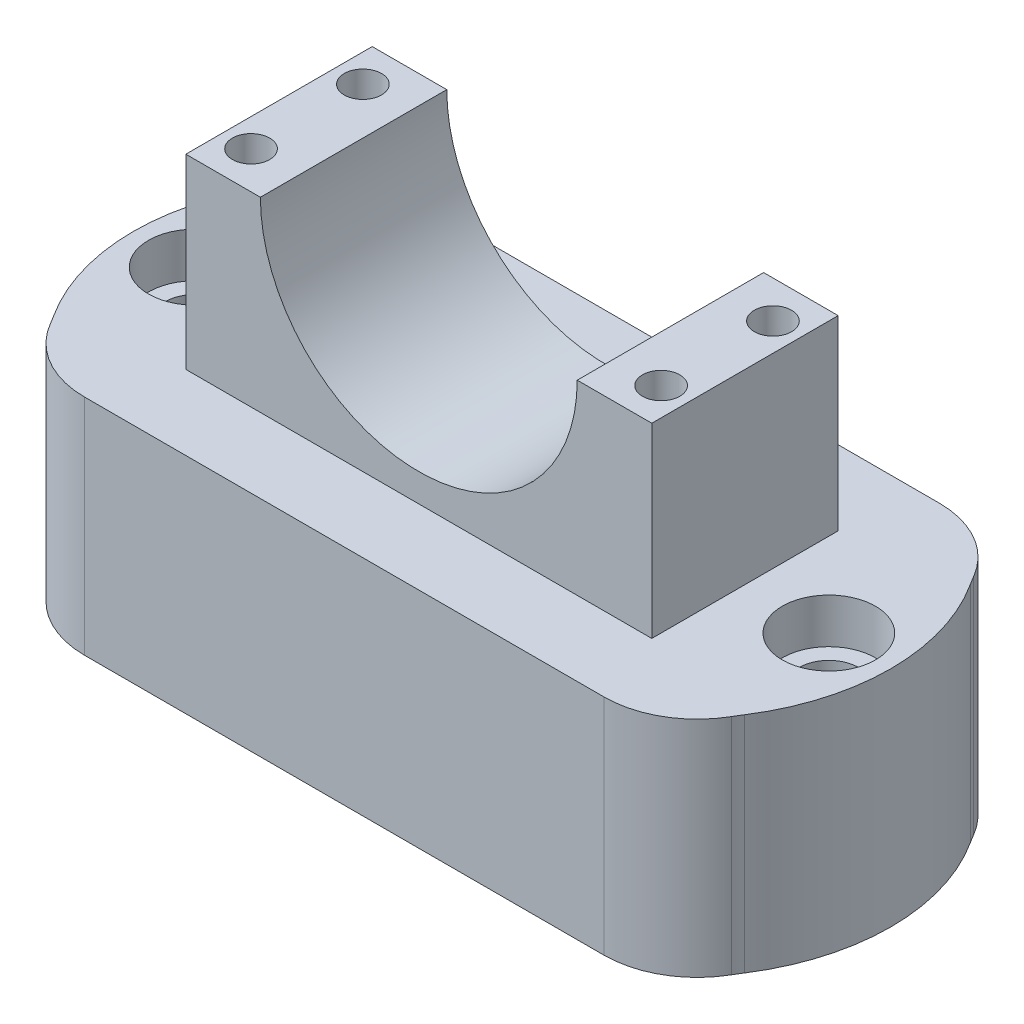
ISO-10303-21;
HEADER;
FILE_DESCRIPTION(('STEP AP214'),'2;1');
FILE_NAME('part.step','',(''),(''),'','','');
FILE_SCHEMA(('AUTOMOTIVE_DESIGN { 1 0 10303 214 1 1 1 1 }'));
ENDSEC;
DATA;
#1=APPLICATION_CONTEXT('core data for automotive mechanical design processes');
#2=APPLICATION_PROTOCOL_DEFINITION('international standard','automotive_design',2000,#1);
#3=PRODUCT_CONTEXT('',#1,'mechanical');
#4=PRODUCT('Part','Part','',(#3));
#5=PRODUCT_RELATED_PRODUCT_CATEGORY('part','',(#4));
#6=PRODUCT_DEFINITION_FORMATION('','',#4);
#7=PRODUCT_DEFINITION_CONTEXT('part definition',#1,'design');
#8=PRODUCT_DEFINITION('design','',#6,#7);
#9=PRODUCT_DEFINITION_SHAPE('','',#8);
#10=(LENGTH_UNIT() NAMED_UNIT(*) SI_UNIT(.MILLI.,.METRE.));
#11=(NAMED_UNIT(*) PLANE_ANGLE_UNIT() SI_UNIT($,.RADIAN.));
#12=(NAMED_UNIT(*) SI_UNIT($,.STERADIAN.) SOLID_ANGLE_UNIT());
#13=UNCERTAINTY_MEASURE_WITH_UNIT(LENGTH_MEASURE(1.E-05),#10,'distance_accuracy_value','');
#14=(GEOMETRIC_REPRESENTATION_CONTEXT(3) GLOBAL_UNCERTAINTY_ASSIGNED_CONTEXT((#13)) GLOBAL_UNIT_ASSIGNED_CONTEXT((#10,
#11,#12)) REPRESENTATION_CONTEXT('',''));
#15=CARTESIAN_POINT('',(0.,0.,0.));
#16=DIRECTION('',(0.,0.,1.));
#17=DIRECTION('',(1.,0.,0.));
#18=AXIS2_PLACEMENT_3D('',#15,#16,#17);
#19=CARTESIAN_POINT('',(43.9369456174816,-4.,-11.4773091677307));
#20=DIRECTION('',(0.,1.,0.));
#21=DIRECTION('',(0.,0.,1.));
#22=AXIS2_PLACEMENT_3D('',#19,#20,#21);
#23=CYLINDRICAL_SURFACE('',#22,10.);
#24=CARTESIAN_POINT('',(43.9369456174816,0.,-11.4773091677307));
#25=DIRECTION('',(0.,1.,0.));
#26=DIRECTION('',(0.,0.,1.));
#27=AXIS2_PLACEMENT_3D('',#24,#25,#26);
#28=CIRCLE('',#27,10.);
#29=CARTESIAN_POINT('',(35.267975472055,0.,-6.49243638924357));
#30=VERTEX_POINT('',#29);
#31=CARTESIAN_POINT('',(35.5353796736744,0.,-6.05387025023017));
#32=VERTEX_POINT('',#31);
#33=EDGE_CURVE('E317',#30,#32,#28,.T.);
#34=ORIENTED_EDGE('',*,*,#33,.F.);
#35=DIRECTION('',(0.,1.,0.));
#36=VECTOR('',#35,1.);
#37=CARTESIAN_POINT('',(35.267975472055,-4.,-6.49243638924357));
#38=LINE('',#37,#36);
#39=CARTESIAN_POINT('',(35.267975472055,12.,-6.49243638924357));
#40=VERTEX_POINT('',#39);
#41=EDGE_CURVE('E179',#30,#40,#38,.T.);
#42=ORIENTED_EDGE('',*,*,#41,.T.);
#43=CARTESIAN_POINT('',(43.9369456174816,12.,-11.4773091677307));
#44=DIRECTION('',(0.,1.,0.));
#45=DIRECTION('',(0.,0.,1.));
#46=AXIS2_PLACEMENT_3D('',#43,#44,#45);
#47=CIRCLE('',#46,10.);
#48=CARTESIAN_POINT('',(35.5353796736744,12.,-6.05387025023017));
#49=VERTEX_POINT('',#48);
#50=EDGE_CURVE('E174',#40,#49,#47,.T.);
#51=ORIENTED_EDGE('',*,*,#50,.T.);
#52=DIRECTION('',(0.,1.,0.));
#53=VECTOR('',#52,1.);
#54=CARTESIAN_POINT('',(35.5353796736744,-4.,-6.05387025023017));
#55=LINE('',#54,#53);
#56=EDGE_CURVE('E177',#32,#49,#55,.T.);
#57=ORIENTED_EDGE('',*,*,#56,.F.);
#58=EDGE_LOOP('',(#34,#42,#51,#57));
#59=FACE_BOUND('',#58,.T.);
#60=ADVANCED_FACE('F34',(#59),#23,.F.);
#61=CARTESIAN_POINT('',(-9.93694561748162,-4.,11.4773091677307));
#62=DIRECTION('',(0.,1.,0.));
#63=DIRECTION('',(0.,0.,1.));
#64=AXIS2_PLACEMENT_3D('',#61,#62,#63);
#65=CYLINDRICAL_SURFACE('',#64,9.99999999999999);
#66=CARTESIAN_POINT('',(-9.93694561748162,0.,11.4773091677307));
#67=DIRECTION('',(0.,1.,0.));
#68=DIRECTION('',(0.,0.,1.));
#69=AXIS2_PLACEMENT_3D('',#66,#67,#68);
#70=CIRCLE('',#69,9.99999999999999);
#71=CARTESIAN_POINT('',(-1.26797547205501,0.,6.49243638924358));
#72=VERTEX_POINT('',#71);
#73=CARTESIAN_POINT('',(-1.53537967367445,0.,6.05387025023018));
#74=VERTEX_POINT('',#73);
#75=EDGE_CURVE('E326',#72,#74,#70,.T.);
#76=ORIENTED_EDGE('',*,*,#75,.F.);
#77=DIRECTION('',(0.,1.,0.));
#78=VECTOR('',#77,1.);
#79=CARTESIAN_POINT('',(-1.26797547205501,-4.,6.49243638924358));
#80=LINE('',#79,#78);
#81=CARTESIAN_POINT('',(-1.26797547205501,12.,6.49243638924358));
#82=VERTEX_POINT('',#81);
#83=EDGE_CURVE('E350',#72,#82,#80,.T.);
#84=ORIENTED_EDGE('',*,*,#83,.T.);
#85=CARTESIAN_POINT('',(-9.93694561748162,12.,11.4773091677307));
#86=DIRECTION('',(0.,1.,0.));
#87=DIRECTION('',(0.,0.,1.));
#88=AXIS2_PLACEMENT_3D('',#85,#86,#87);
#89=CIRCLE('',#88,9.99999999999999);
#90=CARTESIAN_POINT('',(-1.53537967367445,12.,6.05387025023018));
#91=VERTEX_POINT('',#90);
#92=EDGE_CURVE('E215',#82,#91,#89,.T.);
#93=ORIENTED_EDGE('',*,*,#92,.T.);
#94=DIRECTION('',(0.,1.,0.));
#95=VECTOR('',#94,1.);
#96=CARTESIAN_POINT('',(-1.53537967367445,-4.,6.05387025023018));
#97=LINE('',#96,#95);
#98=EDGE_CURVE('E206',#74,#91,#97,.T.);
#99=ORIENTED_EDGE('',*,*,#98,.F.);
#100=EDGE_LOOP('',(#76,#84,#93,#99));
#101=FACE_BOUND('',#100,.T.);
#102=ADVANCED_FACE('F369',(#101),#65,.F.);
#103=CARTESIAN_POINT('',(0.,12.,0.));
#104=DIRECTION('',(0.,1.,0.));
#105=DIRECTION('',(0.,0.,1.));
#106=AXIS2_PLACEMENT_3D('',#103,#104,#105);
#107=PLANE('',#106);
#108=ORIENTED_EDGE('',*,*,#92,.F.);
#109=CARTESIAN_POINT('',(3.0665096006583,12.,4.00000000000001));
#110=DIRECTION('',(0.,1.,0.));
#111=DIRECTION('',(0.,0.,1.));
#112=AXIS2_PLACEMENT_3D('',#109,#110,#111);
#113=CIRCLE('',#112,5.);
#114=CARTESIAN_POINT('',(3.0665096006583,12.,9.00000000000001));
#115=VERTEX_POINT('',#114);
#116=EDGE_CURVE('E355',#82,#115,#113,.T.);
#117=ORIENTED_EDGE('',*,*,#116,.T.);
#118=DIRECTION('',(-1.,0.,0.));
#119=VECTOR('',#118,1.);
#120=CARTESIAN_POINT('',(0.,12.,9.00000000000001));
#121=LINE('',#120,#119);
#122=CARTESIAN_POINT('',(30.9334903993417,12.,9.00000000000001));
#123=VERTEX_POINT('',#122);
#124=EDGE_CURVE('E311',#123,#115,#121,.T.);
#125=ORIENTED_EDGE('',*,*,#124,.F.);
#126=CARTESIAN_POINT('',(30.9334903993417,12.,4.00000000000001));
#127=DIRECTION('',(0.,1.,0.));
#128=DIRECTION('',(0.,0.,1.));
#129=AXIS2_PLACEMENT_3D('',#126,#127,#128);
#130=CIRCLE('',#129,5.);
#131=CARTESIAN_POINT('',(35.267975472055,12.,6.49243638924358));
#132=VERTEX_POINT('',#131);
#133=EDGE_CURVE('E353',#123,#132,#130,.T.);
#134=ORIENTED_EDGE('',*,*,#133,.T.);
#135=CARTESIAN_POINT('',(43.9369456174816,12.,11.4773091677307));
#136=DIRECTION('',(0.,1.,0.));
#137=DIRECTION('',(0.,0.,-1.));
#138=AXIS2_PLACEMENT_3D('',#135,#136,#137);
#139=CIRCLE('',#138,10.);
#140=CARTESIAN_POINT('',(35.5353796736745,12.,6.05387025023017));
#141=VERTEX_POINT('',#140);
#142=EDGE_CURVE('E199',#141,#132,#139,.T.);
#143=ORIENTED_EDGE('',*,*,#142,.F.);
#144=CARTESIAN_POINT('',(26.1571989849535,12.,0.));
#145=DIRECTION('',(0.,-1.,0.));
#146=DIRECTION('',(0.,0.,-1.));
#147=AXIS2_PLACEMENT_3D('',#144,#145,#146);
#148=CIRCLE('',#147,11.1624199005825);
#149=EDGE_CURVE('E188',#49,#141,#148,.T.);
#150=ORIENTED_EDGE('',*,*,#149,.F.);
#151=ORIENTED_EDGE('',*,*,#50,.F.);
#152=CARTESIAN_POINT('',(30.9334903993417,12.,-4.));
#153=DIRECTION('',(0.,1.,0.));
#154=DIRECTION('',(0.,0.,1.));
#155=AXIS2_PLACEMENT_3D('',#152,#153,#154);
#156=CIRCLE('',#155,5.);
#157=CARTESIAN_POINT('',(30.9334903993417,12.,-9.));
#158=VERTEX_POINT('',#157);
#159=EDGE_CURVE('E345',#40,#158,#156,.T.);
#160=ORIENTED_EDGE('',*,*,#159,.T.);
#161=DIRECTION('',(1.,0.,0.));
#162=VECTOR('',#161,1.);
#163=CARTESIAN_POINT('',(0.,12.,-9.));
#164=LINE('',#163,#162);
#165=CARTESIAN_POINT('',(3.0665096006583,12.,-9.));
#166=VERTEX_POINT('',#165);
#167=EDGE_CURVE('E313',#166,#158,#164,.T.);
#168=ORIENTED_EDGE('',*,*,#167,.F.);
#169=CARTESIAN_POINT('',(3.0665096006583,12.,-4.));
#170=DIRECTION('',(0.,1.,0.));
#171=DIRECTION('',(0.,0.,1.));
#172=AXIS2_PLACEMENT_3D('',#169,#170,#171);
#173=CIRCLE('',#172,5.);
#174=CARTESIAN_POINT('',(-1.26797547205501,12.,-6.49243638924357));
#175=VERTEX_POINT('',#174);
#176=EDGE_CURVE('E347',#166,#175,#173,.T.);
#177=ORIENTED_EDGE('',*,*,#176,.T.);
#178=CARTESIAN_POINT('',(-9.93694561748162,12.,-11.4773091677307));
#179=DIRECTION('',(0.,1.,0.));
#180=DIRECTION('',(0.,0.,-1.));
#181=AXIS2_PLACEMENT_3D('',#178,#179,#180);
#182=CIRCLE('',#181,9.99999999999999);
#183=CARTESIAN_POINT('',(-1.53537967367445,12.,-6.05387025023017));
#184=VERTEX_POINT('',#183);
#185=EDGE_CURVE('E183',#184,#175,#182,.T.);
#186=ORIENTED_EDGE('',*,*,#185,.F.);
#187=CARTESIAN_POINT('',(7.84280101504649,12.,0.));
#188=DIRECTION('',(0.,-1.,0.));
#189=DIRECTION('',(0.,0.,1.));
#190=AXIS2_PLACEMENT_3D('',#187,#188,#189);
#191=CIRCLE('',#190,11.1624199005825);
#192=EDGE_CURVE('E204',#91,#184,#191,.T.);
#193=ORIENTED_EDGE('',*,*,#192,.F.);
#194=EDGE_LOOP('',(#108,#117,#125,#134,#143,#150,#151,#160,#168,#177,#186,#193));
#195=FACE_BOUND('',#194,.T.);
#196=CARTESIAN_POINT('',(0.,12.,0.));
#197=DIRECTION('',(0.,1.,0.));
#198=DIRECTION('',(0.,0.,1.));
#199=AXIS2_PLACEMENT_3D('',#196,#197,#198);
#200=CIRCLE('',#199,2.5);
#201=CARTESIAN_POINT('',(0.,12.,2.50000000000001));
#202=VERTEX_POINT('',#201);
#203=EDGE_CURVE('E243',#202,#202,#200,.T.);
#204=ORIENTED_EDGE('',*,*,#203,.F.);
#205=EDGE_LOOP('',(#204));
#206=FACE_BOUND('',#205,.T.);
#207=CARTESIAN_POINT('',(34.,12.,0.));
#208=DIRECTION('',(0.,1.,0.));
#209=DIRECTION('',(0.,0.,1.));
#210=AXIS2_PLACEMENT_3D('',#207,#208,#209);
#211=CIRCLE('',#210,2.5);
#212=CARTESIAN_POINT('',(34.,12.,2.5));
#213=VERTEX_POINT('',#212);
#214=EDGE_CURVE('E253',#213,#213,#211,.T.);
#215=ORIENTED_EDGE('',*,*,#214,.F.);
#216=EDGE_LOOP('',(#215));
#217=FACE_BOUND('',#216,.T.);
#218=DIRECTION('',(0.,0.,-1.));
#219=VECTOR('',#218,1.);
#220=CARTESIAN_POINT('',(29.5,12.,5.));
#221=LINE('',#220,#219);
#222=CARTESIAN_POINT('',(29.5,12.,5.));
#223=VERTEX_POINT('',#222);
#224=CARTESIAN_POINT('',(29.5,12.,-5.));
#225=VERTEX_POINT('',#224);
#226=EDGE_CURVE('E305',#223,#225,#221,.T.);
#227=ORIENTED_EDGE('',*,*,#226,.F.);
#228=DIRECTION('',(1.,0.,0.));
#229=VECTOR('',#228,1.);
#230=CARTESIAN_POINT('',(0.,12.,5.));
#231=LINE('',#230,#229);
#232=CARTESIAN_POINT('',(4.50000000000001,12.,5.));
#233=VERTEX_POINT('',#232);
#234=EDGE_CURVE('E289',#233,#223,#231,.T.);
#235=ORIENTED_EDGE('',*,*,#234,.F.);
#236=DIRECTION('',(0.,0.,-1.));
#237=VECTOR('',#236,1.);
#238=CARTESIAN_POINT('',(4.50000000000001,12.,5.));
#239=LINE('',#238,#237);
#240=CARTESIAN_POINT('',(4.5,12.,-5.));
#241=VERTEX_POINT('',#240);
#242=EDGE_CURVE('E303',#233,#241,#239,.T.);
#243=ORIENTED_EDGE('',*,*,#242,.T.);
#244=DIRECTION('',(1.,0.,0.));
#245=VECTOR('',#244,1.);
#246=CARTESIAN_POINT('',(0.,12.,-5.));
#247=LINE('',#246,#245);
#248=EDGE_CURVE('E272',#241,#225,#247,.T.);
#249=ORIENTED_EDGE('',*,*,#248,.T.);
#250=EDGE_LOOP('',(#227,#235,#243,#249));
#251=FACE_BOUND('',#250,.T.);
#252=ADVANCED_FACE('F196',(#195,#206,#217,#251),#107,.T.);
#253=CARTESIAN_POINT('',(0.,12.,9.00000000000001));
#254=DIRECTION('',(0.,0.,1.));
#255=DIRECTION('',(1.,0.,0.));
#256=AXIS2_PLACEMENT_3D('',#253,#254,#255);
#257=PLANE('',#256);
#258=ORIENTED_EDGE('',*,*,#124,.T.);
#259=DIRECTION('',(0.,-1.,0.));
#260=VECTOR('',#259,1.);
#261=CARTESIAN_POINT('',(3.0665096006583,0.,9.00000000000001));
#262=LINE('',#261,#260);
#263=CARTESIAN_POINT('',(3.0665096006583,0.,9.00000000000001));
#264=VERTEX_POINT('',#263);
#265=EDGE_CURVE('E56',#115,#264,#262,.T.);
#266=ORIENTED_EDGE('',*,*,#265,.T.);
#267=DIRECTION('',(-1.,0.,0.));
#268=VECTOR('',#267,1.);
#269=CARTESIAN_POINT('',(0.,0.,9.00000000000001));
#270=LINE('',#269,#268);
#271=CARTESIAN_POINT('',(30.9334903993417,0.,9.00000000000001));
#272=VERTEX_POINT('',#271);
#273=EDGE_CURVE('E300',#272,#264,#270,.T.);
#274=ORIENTED_EDGE('',*,*,#273,.F.);
#275=DIRECTION('',(0.,-1.,0.));
#276=VECTOR('',#275,1.);
#277=CARTESIAN_POINT('',(30.9334903993417,12.,9.00000000000001));
#278=LINE('',#277,#276);
#279=EDGE_CURVE('E357',#272,#123,#278,.F.);
#280=ORIENTED_EDGE('',*,*,#279,.T.);
#281=EDGE_LOOP('',(#258,#266,#274,#280));
#282=FACE_BOUND('',#281,.T.);
#283=ADVANCED_FACE('F374',(#282),#257,.T.);
#284=CARTESIAN_POINT('',(0.,12.,-9.));
#285=DIRECTION('',(0.,0.,-1.));
#286=DIRECTION('',(-1.,0.,0.));
#287=AXIS2_PLACEMENT_3D('',#284,#285,#286);
#288=PLANE('',#287);
#289=DIRECTION('',(1.,0.,0.));
#290=VECTOR('',#289,1.);
#291=CARTESIAN_POINT('',(0.,0.,-9.));
#292=LINE('',#291,#290);
#293=CARTESIAN_POINT('',(3.0665096006583,0.,-9.));
#294=VERTEX_POINT('',#293);
#295=CARTESIAN_POINT('',(30.9334903993417,0.,-9.));
#296=VERTEX_POINT('',#295);
#297=EDGE_CURVE('E314',#294,#296,#292,.T.);
#298=ORIENTED_EDGE('',*,*,#297,.F.);
#299=DIRECTION('',(0.,-1.,0.));
#300=VECTOR('',#299,1.);
#301=CARTESIAN_POINT('',(3.0665096006583,12.,-9.));
#302=LINE('',#301,#300);
#303=EDGE_CURVE('E343',#294,#166,#302,.F.);
#304=ORIENTED_EDGE('',*,*,#303,.T.);
#305=ORIENTED_EDGE('',*,*,#167,.T.);
#306=DIRECTION('',(0.,-1.,0.));
#307=VECTOR('',#306,1.);
#308=CARTESIAN_POINT('',(30.9334903993417,0.,-9.));
#309=LINE('',#308,#307);
#310=EDGE_CURVE('E341',#158,#296,#309,.T.);
#311=ORIENTED_EDGE('',*,*,#310,.T.);
#312=EDGE_LOOP('',(#298,#304,#305,#311));
#313=FACE_BOUND('',#312,.T.);
#314=ADVANCED_FACE('F386',(#313),#288,.T.);
#315=CARTESIAN_POINT('',(0.,0.,0.));
#316=DIRECTION('',(0.,1.,0.));
#317=DIRECTION('',(0.,0.,1.));
#318=AXIS2_PLACEMENT_3D('',#315,#316,#317);
#319=PLANE('',#318);
#320=CARTESIAN_POINT('',(0.,0.,0.));
#321=DIRECTION('',(0.,1.,0.));
#322=DIRECTION('',(0.,0.,1.));
#323=AXIS2_PLACEMENT_3D('',#320,#321,#322);
#324=CIRCLE('',#323,1.59999999999999);
#325=CARTESIAN_POINT('',(0.,0.,1.6));
#326=VERTEX_POINT('',#325);
#327=EDGE_CURVE('E252',#326,#326,#324,.T.);
#328=ORIENTED_EDGE('',*,*,#327,.T.);
#329=EDGE_LOOP('',(#328));
#330=FACE_BOUND('',#329,.T.);
#331=CARTESIAN_POINT('',(34.,0.,0.));
#332=DIRECTION('',(0.,1.,0.));
#333=DIRECTION('',(0.,0.,1.));
#334=AXIS2_PLACEMENT_3D('',#331,#332,#333);
#335=CIRCLE('',#334,1.59999999999999);
#336=CARTESIAN_POINT('',(34.,0.,1.59999999999999));
#337=VERTEX_POINT('',#336);
#338=EDGE_CURVE('E262',#337,#337,#335,.T.);
#339=ORIENTED_EDGE('',*,*,#338,.T.);
#340=EDGE_LOOP('',(#339));
#341=FACE_BOUND('',#340,.T.);
#342=ORIENTED_EDGE('',*,*,#273,.T.);
#343=CARTESIAN_POINT('',(3.0665096006583,0.,4.00000000000001));
#344=DIRECTION('',(0.,1.,0.));
#345=DIRECTION('',(0.,0.,1.));
#346=AXIS2_PLACEMENT_3D('',#343,#344,#345);
#347=CIRCLE('',#346,5.);
#348=EDGE_CURVE('E42',#264,#72,#347,.F.);
#349=ORIENTED_EDGE('',*,*,#348,.T.);
#350=ORIENTED_EDGE('',*,*,#75,.T.);
#351=CARTESIAN_POINT('',(7.84280101504649,0.,0.));
#352=DIRECTION('',(0.,1.,0.));
#353=DIRECTION('',(0.,0.,1.));
#354=AXIS2_PLACEMENT_3D('',#351,#352,#353);
#355=CIRCLE('',#354,11.1624199005825);
#356=CARTESIAN_POINT('',(-1.53537967367445,0.,-6.05387025023017));
#357=VERTEX_POINT('',#356);
#358=EDGE_CURVE('E210',#74,#357,#355,.F.);
#359=ORIENTED_EDGE('',*,*,#358,.T.);
#360=CARTESIAN_POINT('',(-9.93694561748162,0.,-11.4773091677307));
#361=DIRECTION('',(0.,1.,0.));
#362=DIRECTION('',(0.,0.,1.));
#363=AXIS2_PLACEMENT_3D('',#360,#361,#362);
#364=CIRCLE('',#363,9.99999999999999);
#365=CARTESIAN_POINT('',(-1.26797547205501,0.,-6.49243638924357));
#366=VERTEX_POINT('',#365);
#367=EDGE_CURVE('E331',#357,#366,#364,.T.);
#368=ORIENTED_EDGE('',*,*,#367,.T.);
#369=CARTESIAN_POINT('',(3.0665096006583,0.,-4.));
#370=DIRECTION('',(0.,1.,0.));
#371=DIRECTION('',(0.,0.,1.));
#372=AXIS2_PLACEMENT_3D('',#369,#370,#371);
#373=CIRCLE('',#372,5.);
#374=EDGE_CURVE('E339',#366,#294,#373,.F.);
#375=ORIENTED_EDGE('',*,*,#374,.T.);
#376=ORIENTED_EDGE('',*,*,#297,.T.);
#377=CARTESIAN_POINT('',(30.9334903993417,0.,-4.));
#378=DIRECTION('',(0.,1.,0.));
#379=DIRECTION('',(0.,0.,1.));
#380=AXIS2_PLACEMENT_3D('',#377,#378,#379);
#381=CIRCLE('',#380,5.);
#382=EDGE_CURVE('E337',#296,#30,#381,.F.);
#383=ORIENTED_EDGE('',*,*,#382,.T.);
#384=ORIENTED_EDGE('',*,*,#33,.T.);
#385=CARTESIAN_POINT('',(26.1571989849535,0.,0.));
#386=DIRECTION('',(0.,1.,0.));
#387=DIRECTION('',(0.,0.,1.));
#388=AXIS2_PLACEMENT_3D('',#385,#386,#387);
#389=CIRCLE('',#388,11.1624199005825);
#390=CARTESIAN_POINT('',(35.5353796736744,0.,6.05387025023018));
#391=VERTEX_POINT('',#390);
#392=EDGE_CURVE('E191',#32,#391,#389,.F.);
#393=ORIENTED_EDGE('',*,*,#392,.T.);
#394=CARTESIAN_POINT('',(43.9369456174816,0.,11.4773091677307));
#395=DIRECTION('',(0.,1.,0.));
#396=DIRECTION('',(0.,0.,1.));
#397=AXIS2_PLACEMENT_3D('',#394,#395,#396);
#398=CIRCLE('',#397,10.);
#399=CARTESIAN_POINT('',(35.267975472055,0.,6.49243638924358));
#400=VERTEX_POINT('',#399);
#401=EDGE_CURVE('E328',#391,#400,#398,.T.);
#402=ORIENTED_EDGE('',*,*,#401,.T.);
#403=CARTESIAN_POINT('',(30.9334903993417,0.,4.00000000000001));
#404=DIRECTION('',(0.,1.,0.));
#405=DIRECTION('',(0.,0.,1.));
#406=AXIS2_PLACEMENT_3D('',#403,#404,#405);
#407=CIRCLE('',#406,5.);
#408=EDGE_CURVE('E49',#400,#272,#407,.F.);
#409=ORIENTED_EDGE('',*,*,#408,.T.);
#410=EDGE_LOOP('',(#342,#349,#350,#359,#368,#375,#376,#383,#384,#393,#402,#409));
#411=FACE_BOUND('',#410,.T.);
#412=ADVANCED_FACE('F363',(#330,#341,#411),#319,.F.);
#413=CARTESIAN_POINT('',(17.,22.,5.));
#414=DIRECTION('',(0.,0.,-1.));
#415=DIRECTION('',(-1.,0.,0.));
#416=AXIS2_PLACEMENT_3D('',#413,#414,#415);
#417=CYLINDRICAL_SURFACE('',#416,8.5);
#418=DIRECTION('',(0.,0.,-1.));
#419=VECTOR('',#418,1.);
#420=CARTESIAN_POINT('',(25.5,22.,5.));
#421=LINE('',#420,#419);
#422=CARTESIAN_POINT('',(25.5,22.,5.));
#423=VERTEX_POINT('',#422);
#424=CARTESIAN_POINT('',(25.5,22.,-5.));
#425=VERTEX_POINT('',#424);
#426=EDGE_CURVE('E297',#423,#425,#421,.T.);
#427=ORIENTED_EDGE('',*,*,#426,.T.);
#428=CARTESIAN_POINT('',(17.,22.,-5.));
#429=DIRECTION('',(0.,0.,-1.));
#430=DIRECTION('',(-1.,0.,0.));
#431=AXIS2_PLACEMENT_3D('',#428,#429,#430);
#432=CIRCLE('',#431,8.5);
#433=CARTESIAN_POINT('',(8.5,22.,-5.));
#434=VERTEX_POINT('',#433);
#435=EDGE_CURVE('E263',#425,#434,#432,.T.);
#436=ORIENTED_EDGE('',*,*,#435,.T.);
#437=DIRECTION('',(0.,0.,-1.));
#438=VECTOR('',#437,1.);
#439=CARTESIAN_POINT('',(8.5,22.,5.));
#440=LINE('',#439,#438);
#441=CARTESIAN_POINT('',(8.5,22.,5.));
#442=VERTEX_POINT('',#441);
#443=EDGE_CURVE('E298',#442,#434,#440,.T.);
#444=ORIENTED_EDGE('',*,*,#443,.F.);
#445=CARTESIAN_POINT('',(17.,22.,5.));
#446=DIRECTION('',(0.,0.,-1.));
#447=DIRECTION('',(-1.,0.,0.));
#448=AXIS2_PLACEMENT_3D('',#445,#446,#447);
#449=CIRCLE('',#448,8.5);
#450=EDGE_CURVE('E280',#423,#442,#449,.T.);
#451=ORIENTED_EDGE('',*,*,#450,.F.);
#452=EDGE_LOOP('',(#427,#436,#444,#451));
#453=FACE_BOUND('',#452,.T.);
#454=ADVANCED_FACE('F482',(#453),#417,.F.);
#455=CARTESIAN_POINT('',(0.,22.,5.));
#456=DIRECTION('',(0.,-1.,0.));
#457=DIRECTION('',(0.,0.,-1.));
#458=AXIS2_PLACEMENT_3D('',#455,#456,#457);
#459=PLANE('',#458);
#460=CARTESIAN_POINT('',(6.00000000000001,22.,-3.));
#461=DIRECTION('',(0.,1.,0.));
#462=DIRECTION('',(0.,0.,1.));
#463=AXIS2_PLACEMENT_3D('',#460,#461,#462);
#464=CIRCLE('',#463,0.999999999999997);
#465=CARTESIAN_POINT('',(6.00000000000001,22.,-2.));
#466=VERTEX_POINT('',#465);
#467=EDGE_CURVE('E182',#466,#466,#464,.T.);
#468=ORIENTED_EDGE('',*,*,#467,.F.);
#469=EDGE_LOOP('',(#468));
#470=FACE_BOUND('',#469,.T.);
#471=CARTESIAN_POINT('',(6.00000000000001,22.,3.));
#472=DIRECTION('',(0.,1.,0.));
#473=DIRECTION('',(0.,0.,1.));
#474=AXIS2_PLACEMENT_3D('',#471,#472,#473);
#475=CIRCLE('',#474,0.999999999999997);
#476=CARTESIAN_POINT('',(6.00000000000001,22.,4.));
#477=VERTEX_POINT('',#476);
#478=EDGE_CURVE('E225',#477,#477,#475,.T.);
#479=ORIENTED_EDGE('',*,*,#478,.F.);
#480=EDGE_LOOP('',(#479));
#481=FACE_BOUND('',#480,.T.);
#482=ORIENTED_EDGE('',*,*,#443,.T.);
#483=DIRECTION('',(-1.,0.,0.));
#484=VECTOR('',#483,1.);
#485=CARTESIAN_POINT('',(0.,22.,-5.));
#486=LINE('',#485,#484);
#487=CARTESIAN_POINT('',(4.5,22.,-5.));
#488=VERTEX_POINT('',#487);
#489=EDGE_CURVE('E277',#434,#488,#486,.T.);
#490=ORIENTED_EDGE('',*,*,#489,.T.);
#491=DIRECTION('',(0.,0.,-1.));
#492=VECTOR('',#491,1.);
#493=CARTESIAN_POINT('',(4.5,22.,5.));
#494=LINE('',#493,#492);
#495=CARTESIAN_POINT('',(4.5,22.,5.));
#496=VERTEX_POINT('',#495);
#497=EDGE_CURVE('E301',#496,#488,#494,.T.);
#498=ORIENTED_EDGE('',*,*,#497,.F.);
#499=DIRECTION('',(-1.,0.,0.));
#500=VECTOR('',#499,1.);
#501=CARTESIAN_POINT('',(0.,22.,5.));
#502=LINE('',#501,#500);
#503=EDGE_CURVE('E295',#442,#496,#502,.T.);
#504=ORIENTED_EDGE('',*,*,#503,.F.);
#505=EDGE_LOOP('',(#482,#490,#498,#504));
#506=FACE_BOUND('',#505,.T.);
#507=ADVANCED_FACE('F478',(#470,#481,#506),#459,.F.);
#508=CARTESIAN_POINT('',(4.50000000000001,0.,5.));
#509=DIRECTION('',(1.,0.,0.));
#510=DIRECTION('',(0.,0.,-1.));
#511=AXIS2_PLACEMENT_3D('',#508,#509,#510);
#512=PLANE('',#511);
#513=ORIENTED_EDGE('',*,*,#497,.T.);
#514=DIRECTION('',(0.,-1.,0.));
#515=VECTOR('',#514,1.);
#516=CARTESIAN_POINT('',(4.5,0.,-5.));
#517=LINE('',#516,#515);
#518=EDGE_CURVE('E274',#488,#241,#517,.T.);
#519=ORIENTED_EDGE('',*,*,#518,.T.);
#520=ORIENTED_EDGE('',*,*,#242,.F.);
#521=DIRECTION('',(0.,-1.,0.));
#522=VECTOR('',#521,1.);
#523=CARTESIAN_POINT('',(4.50000000000001,0.,5.));
#524=LINE('',#523,#522);
#525=EDGE_CURVE('E292',#496,#233,#524,.T.);
#526=ORIENTED_EDGE('',*,*,#525,.F.);
#527=EDGE_LOOP('',(#513,#519,#520,#526));
#528=FACE_BOUND('',#527,.T.);
#529=ADVANCED_FACE('F481',(#528),#512,.F.);
#530=CARTESIAN_POINT('',(29.5,0.,5.));
#531=DIRECTION('',(1.,0.,0.));
#532=DIRECTION('',(0.,0.,-1.));
#533=AXIS2_PLACEMENT_3D('',#530,#531,#532);
#534=PLANE('',#533);
#535=ORIENTED_EDGE('',*,*,#226,.T.);
#536=DIRECTION('',(0.,-1.,0.));
#537=VECTOR('',#536,1.);
#538=CARTESIAN_POINT('',(29.5,0.,-5.));
#539=LINE('',#538,#537);
#540=CARTESIAN_POINT('',(29.5,22.,-5.));
#541=VERTEX_POINT('',#540);
#542=EDGE_CURVE('E269',#541,#225,#539,.T.);
#543=ORIENTED_EDGE('',*,*,#542,.F.);
#544=DIRECTION('',(0.,0.,-1.));
#545=VECTOR('',#544,1.);
#546=CARTESIAN_POINT('',(29.5,22.,5.));
#547=LINE('',#546,#545);
#548=CARTESIAN_POINT('',(29.5,22.,5.));
#549=VERTEX_POINT('',#548);
#550=EDGE_CURVE('E308',#549,#541,#547,.T.);
#551=ORIENTED_EDGE('',*,*,#550,.F.);
#552=DIRECTION('',(0.,-1.,0.));
#553=VECTOR('',#552,1.);
#554=CARTESIAN_POINT('',(29.5,0.,5.));
#555=LINE('',#554,#553);
#556=EDGE_CURVE('E286',#549,#223,#555,.T.);
#557=ORIENTED_EDGE('',*,*,#556,.T.);
#558=EDGE_LOOP('',(#535,#543,#551,#557));
#559=FACE_BOUND('',#558,.T.);
#560=ADVANCED_FACE('F486',(#559),#534,.T.);
#561=CARTESIAN_POINT('',(0.,22.,5.));
#562=DIRECTION('',(0.,1.,0.));
#563=DIRECTION('',(0.,0.,1.));
#564=AXIS2_PLACEMENT_3D('',#561,#562,#563);
#565=PLANE('',#564);
#566=CARTESIAN_POINT('',(28.,22.,-3.));
#567=DIRECTION('',(0.,1.,0.));
#568=DIRECTION('',(0.,0.,1.));
#569=AXIS2_PLACEMENT_3D('',#566,#567,#568);
#570=CIRCLE('',#569,0.999999999999997);
#571=CARTESIAN_POINT('',(28.,22.,-2.));
#572=VERTEX_POINT('',#571);
#573=EDGE_CURVE('E231',#572,#572,#570,.T.);
#574=ORIENTED_EDGE('',*,*,#573,.F.);
#575=EDGE_LOOP('',(#574));
#576=FACE_BOUND('',#575,.T.);
#577=CARTESIAN_POINT('',(28.,22.,3.));
#578=DIRECTION('',(0.,1.,0.));
#579=DIRECTION('',(0.,0.,1.));
#580=AXIS2_PLACEMENT_3D('',#577,#578,#579);
#581=CIRCLE('',#580,0.999999999999997);
#582=CARTESIAN_POINT('',(28.,22.,4.));
#583=VERTEX_POINT('',#582);
#584=EDGE_CURVE('E237',#583,#583,#581,.T.);
#585=ORIENTED_EDGE('',*,*,#584,.F.);
#586=EDGE_LOOP('',(#585));
#587=FACE_BOUND('',#586,.T.);
#588=ORIENTED_EDGE('',*,*,#550,.T.);
#589=DIRECTION('',(1.,0.,0.));
#590=VECTOR('',#589,1.);
#591=CARTESIAN_POINT('',(0.,22.,-5.));
#592=LINE('',#591,#590);
#593=EDGE_CURVE('E266',#425,#541,#592,.T.);
#594=ORIENTED_EDGE('',*,*,#593,.F.);
#595=ORIENTED_EDGE('',*,*,#426,.F.);
#596=DIRECTION('',(1.,0.,0.));
#597=VECTOR('',#596,1.);
#598=CARTESIAN_POINT('',(0.,22.,5.));
#599=LINE('',#598,#597);
#600=EDGE_CURVE('E283',#423,#549,#599,.T.);
#601=ORIENTED_EDGE('',*,*,#600,.T.);
#602=EDGE_LOOP('',(#588,#594,#595,#601));
#603=FACE_BOUND('',#602,.T.);
#604=ADVANCED_FACE('F476',(#576,#587,#603),#565,.T.);
#605=CARTESIAN_POINT('',(0.,0.,5.));
#606=DIRECTION('',(0.,0.,-1.));
#607=DIRECTION('',(-1.,0.,0.));
#608=AXIS2_PLACEMENT_3D('',#605,#606,#607);
#609=PLANE('',#608);
#610=ORIENTED_EDGE('',*,*,#450,.T.);
#611=ORIENTED_EDGE('',*,*,#503,.T.);
#612=ORIENTED_EDGE('',*,*,#525,.T.);
#613=ORIENTED_EDGE('',*,*,#234,.T.);
#614=ORIENTED_EDGE('',*,*,#556,.F.);
#615=ORIENTED_EDGE('',*,*,#600,.F.);
#616=EDGE_LOOP('',(#610,#611,#612,#613,#614,#615));
#617=FACE_BOUND('',#616,.T.);
#618=ADVANCED_FACE('F472',(#617),#609,.F.);
#619=CARTESIAN_POINT('',(0.,0.,-5.));
#620=DIRECTION('',(0.,0.,-1.));
#621=DIRECTION('',(-1.,0.,0.));
#622=AXIS2_PLACEMENT_3D('',#619,#620,#621);
#623=PLANE('',#622);
#624=ORIENTED_EDGE('',*,*,#435,.F.);
#625=ORIENTED_EDGE('',*,*,#593,.T.);
#626=ORIENTED_EDGE('',*,*,#542,.T.);
#627=ORIENTED_EDGE('',*,*,#248,.F.);
#628=ORIENTED_EDGE('',*,*,#518,.F.);
#629=ORIENTED_EDGE('',*,*,#489,.F.);
#630=EDGE_LOOP('',(#624,#625,#626,#627,#628,#629));
#631=FACE_BOUND('',#630,.T.);
#632=ADVANCED_FACE('F468',(#631),#623,.T.);
#633=CARTESIAN_POINT('',(34.,12.,0.));
#634=DIRECTION('',(0.,1.,0.));
#635=DIRECTION('',(0.,0.,1.));
#636=AXIS2_PLACEMENT_3D('',#633,#634,#635);
#637=CYLINDRICAL_SURFACE('',#636,1.59999999999999);
#638=CARTESIAN_POINT('',(34.,9.6,0.));
#639=DIRECTION('',(0.,1.,0.));
#640=DIRECTION('',(0.,0.,1.));
#641=AXIS2_PLACEMENT_3D('',#638,#639,#640);
#642=CIRCLE('',#641,1.6);
#643=CARTESIAN_POINT('',(34.,9.6,1.6));
#644=VERTEX_POINT('',#643);
#645=EDGE_CURVE('E259',#644,#644,#642,.T.);
#646=ORIENTED_EDGE('',*,*,#645,.T.);
#647=EDGE_LOOP('',(#646));
#648=FACE_BOUND('',#647,.T.);
#649=ORIENTED_EDGE('',*,*,#338,.F.);
#650=EDGE_LOOP('',(#649));
#651=FACE_BOUND('',#650,.T.);
#652=ADVANCED_FACE('F464',(#648,#651),#637,.F.);
#653=CARTESIAN_POINT('',(35.6,9.6,0.));
#654=DIRECTION('',(0.,-1.,0.));
#655=DIRECTION('',(0.,0.,-1.));
#656=AXIS2_PLACEMENT_3D('',#653,#654,#655);
#657=PLANE('',#656);
#658=ORIENTED_EDGE('',*,*,#645,.F.);
#659=EDGE_LOOP('',(#658));
#660=FACE_BOUND('',#659,.T.);
#661=CARTESIAN_POINT('',(34.,9.6,0.));
#662=DIRECTION('',(0.,1.,0.));
#663=DIRECTION('',(0.,0.,1.));
#664=AXIS2_PLACEMENT_3D('',#661,#662,#663);
#665=CIRCLE('',#664,2.5);
#666=CARTESIAN_POINT('',(34.,9.6,2.5));
#667=VERTEX_POINT('',#666);
#668=EDGE_CURVE('E256',#667,#667,#665,.T.);
#669=ORIENTED_EDGE('',*,*,#668,.T.);
#670=EDGE_LOOP('',(#669));
#671=FACE_BOUND('',#670,.T.);
#672=ADVANCED_FACE('F460',(#660,#671),#657,.F.);
#673=CARTESIAN_POINT('',(34.,12.,0.));
#674=DIRECTION('',(0.,1.,0.));
#675=DIRECTION('',(0.,0.,1.));
#676=AXIS2_PLACEMENT_3D('',#673,#674,#675);
#677=CYLINDRICAL_SURFACE('',#676,2.5);
#678=ORIENTED_EDGE('',*,*,#668,.F.);
#679=EDGE_LOOP('',(#678));
#680=FACE_BOUND('',#679,.T.);
#681=ORIENTED_EDGE('',*,*,#214,.T.);
#682=EDGE_LOOP('',(#681));
#683=FACE_BOUND('',#682,.T.);
#684=ADVANCED_FACE('F456',(#680,#683),#677,.F.);
#685=CARTESIAN_POINT('',(0.,12.,0.));
#686=DIRECTION('',(0.,1.,0.));
#687=DIRECTION('',(0.,0.,1.));
#688=AXIS2_PLACEMENT_3D('',#685,#686,#687);
#689=CYLINDRICAL_SURFACE('',#688,1.59999999999999);
#690=CARTESIAN_POINT('',(0.,9.6,0.));
#691=DIRECTION('',(0.,1.,0.));
#692=DIRECTION('',(0.,0.,1.));
#693=AXIS2_PLACEMENT_3D('',#690,#691,#692);
#694=CIRCLE('',#693,1.6);
#695=CARTESIAN_POINT('',(0.,9.6,1.6));
#696=VERTEX_POINT('',#695);
#697=EDGE_CURVE('E249',#696,#696,#694,.T.);
#698=ORIENTED_EDGE('',*,*,#697,.T.);
#699=EDGE_LOOP('',(#698));
#700=FACE_BOUND('',#699,.T.);
#701=ORIENTED_EDGE('',*,*,#327,.F.);
#702=EDGE_LOOP('',(#701));
#703=FACE_BOUND('',#702,.T.);
#704=ADVANCED_FACE('F452',(#700,#703),#689,.F.);
#705=CARTESIAN_POINT('',(1.6,9.6,0.));
#706=DIRECTION('',(0.,-1.,0.));
#707=DIRECTION('',(0.,0.,-1.));
#708=AXIS2_PLACEMENT_3D('',#705,#706,#707);
#709=PLANE('',#708);
#710=ORIENTED_EDGE('',*,*,#697,.F.);
#711=EDGE_LOOP('',(#710));
#712=FACE_BOUND('',#711,.T.);
#713=CARTESIAN_POINT('',(0.,9.6,0.));
#714=DIRECTION('',(0.,1.,0.));
#715=DIRECTION('',(0.,0.,1.));
#716=AXIS2_PLACEMENT_3D('',#713,#714,#715);
#717=CIRCLE('',#716,2.5);
#718=CARTESIAN_POINT('',(0.,9.6,2.5));
#719=VERTEX_POINT('',#718);
#720=EDGE_CURVE('E246',#719,#719,#717,.T.);
#721=ORIENTED_EDGE('',*,*,#720,.T.);
#722=EDGE_LOOP('',(#721));
#723=FACE_BOUND('',#722,.T.);
#724=ADVANCED_FACE('F448',(#712,#723),#709,.F.);
#725=CARTESIAN_POINT('',(0.,12.,0.));
#726=DIRECTION('',(0.,1.,0.));
#727=DIRECTION('',(0.,0.,1.));
#728=AXIS2_PLACEMENT_3D('',#725,#726,#727);
#729=CYLINDRICAL_SURFACE('',#728,2.5);
#730=ORIENTED_EDGE('',*,*,#720,.F.);
#731=EDGE_LOOP('',(#730));
#732=FACE_BOUND('',#731,.T.);
#733=ORIENTED_EDGE('',*,*,#203,.T.);
#734=EDGE_LOOP('',(#733));
#735=FACE_BOUND('',#734,.T.);
#736=ADVANCED_FACE('F444',(#732,#735),#729,.F.);
#737=CARTESIAN_POINT('',(28.,7.00000000000001,3.));
#738=DIRECTION('',(0.,1.,0.));
#739=DIRECTION('',(0.,0.,1.));
#740=AXIS2_PLACEMENT_3D('',#737,#738,#739);
#741=CONICAL_SURFACE('',#740,0.999999999999997,1.02974425867665);
#742=CARTESIAN_POINT('',(28.,6.39913938097245,3.));
#743=VERTEX_POINT('',#742);
#744=VERTEX_LOOP('',#743);
#745=FACE_BOUND('',#744,.T.);
#746=CARTESIAN_POINT('',(28.,7.00000000000001,3.));
#747=DIRECTION('',(0.,1.,0.));
#748=DIRECTION('',(0.,0.,1.));
#749=AXIS2_PLACEMENT_3D('',#746,#747,#748);
#750=CIRCLE('',#749,0.999999999999997);
#751=CARTESIAN_POINT('',(28.,7.00000000000001,4.));
#752=VERTEX_POINT('',#751);
#753=EDGE_CURVE('E240',#752,#752,#750,.T.);
#754=ORIENTED_EDGE('',*,*,#753,.T.);
#755=EDGE_LOOP('',(#754));
#756=FACE_BOUND('',#755,.T.);
#757=ADVANCED_FACE('F440',(#745,#756),#741,.F.);
#758=CARTESIAN_POINT('',(28.,22.,3.));
#759=DIRECTION('',(0.,1.,0.));
#760=DIRECTION('',(0.,0.,1.));
#761=AXIS2_PLACEMENT_3D('',#758,#759,#760);
#762=CYLINDRICAL_SURFACE('',#761,0.999999999999997);
#763=ORIENTED_EDGE('',*,*,#753,.F.);
#764=EDGE_LOOP('',(#763));
#765=FACE_BOUND('',#764,.T.);
#766=ORIENTED_EDGE('',*,*,#584,.T.);
#767=EDGE_LOOP('',(#766));
#768=FACE_BOUND('',#767,.T.);
#769=ADVANCED_FACE('F436',(#765,#768),#762,.F.);
#770=CARTESIAN_POINT('',(28.,7.00000000000001,-3.));
#771=DIRECTION('',(0.,1.,0.));
#772=DIRECTION('',(0.,0.,1.));
#773=AXIS2_PLACEMENT_3D('',#770,#771,#772);
#774=CONICAL_SURFACE('',#773,0.999999999999997,1.02974425867665);
#775=CARTESIAN_POINT('',(28.,6.39913938097245,-3.));
#776=VERTEX_POINT('',#775);
#777=VERTEX_LOOP('',#776);
#778=FACE_BOUND('',#777,.T.);
#779=CARTESIAN_POINT('',(28.,7.00000000000001,-3.));
#780=DIRECTION('',(0.,1.,0.));
#781=DIRECTION('',(0.,0.,1.));
#782=AXIS2_PLACEMENT_3D('',#779,#780,#781);
#783=CIRCLE('',#782,0.999999999999997);
#784=CARTESIAN_POINT('',(28.,7.00000000000001,-2.));
#785=VERTEX_POINT('',#784);
#786=EDGE_CURVE('E234',#785,#785,#783,.T.);
#787=ORIENTED_EDGE('',*,*,#786,.T.);
#788=EDGE_LOOP('',(#787));
#789=FACE_BOUND('',#788,.T.);
#790=ADVANCED_FACE('F432',(#778,#789),#774,.F.);
#791=CARTESIAN_POINT('',(28.,22.,-3.));
#792=DIRECTION('',(0.,1.,0.));
#793=DIRECTION('',(0.,0.,1.));
#794=AXIS2_PLACEMENT_3D('',#791,#792,#793);
#795=CYLINDRICAL_SURFACE('',#794,0.999999999999997);
#796=ORIENTED_EDGE('',*,*,#786,.F.);
#797=EDGE_LOOP('',(#796));
#798=FACE_BOUND('',#797,.T.);
#799=ORIENTED_EDGE('',*,*,#573,.T.);
#800=EDGE_LOOP('',(#799));
#801=FACE_BOUND('',#800,.T.);
#802=ADVANCED_FACE('F428',(#798,#801),#795,.F.);
#803=CARTESIAN_POINT('',(6.00000000000001,7.00000000000001,3.));
#804=DIRECTION('',(0.,1.,0.));
#805=DIRECTION('',(0.,0.,1.));
#806=AXIS2_PLACEMENT_3D('',#803,#804,#805);
#807=CONICAL_SURFACE('',#806,0.999999999999997,1.02974425867665);
#808=CARTESIAN_POINT('',(6.,6.39913938097245,3.));
#809=VERTEX_POINT('',#808);
#810=VERTEX_LOOP('',#809);
#811=FACE_BOUND('',#810,.T.);
#812=CARTESIAN_POINT('',(6.00000000000001,7.00000000000001,3.));
#813=DIRECTION('',(0.,1.,0.));
#814=DIRECTION('',(0.,0.,1.));
#815=AXIS2_PLACEMENT_3D('',#812,#813,#814);
#816=CIRCLE('',#815,0.999999999999997);
#817=CARTESIAN_POINT('',(6.00000000000001,7.00000000000001,4.));
#818=VERTEX_POINT('',#817);
#819=EDGE_CURVE('E228',#818,#818,#816,.T.);
#820=ORIENTED_EDGE('',*,*,#819,.T.);
#821=EDGE_LOOP('',(#820));
#822=FACE_BOUND('',#821,.T.);
#823=ADVANCED_FACE('F424',(#811,#822),#807,.F.);
#824=CARTESIAN_POINT('',(6.00000000000001,22.,3.));
#825=DIRECTION('',(0.,1.,0.));
#826=DIRECTION('',(0.,0.,1.));
#827=AXIS2_PLACEMENT_3D('',#824,#825,#826);
#828=CYLINDRICAL_SURFACE('',#827,0.999999999999997);
#829=ORIENTED_EDGE('',*,*,#819,.F.);
#830=EDGE_LOOP('',(#829));
#831=FACE_BOUND('',#830,.T.);
#832=ORIENTED_EDGE('',*,*,#478,.T.);
#833=EDGE_LOOP('',(#832));
#834=FACE_BOUND('',#833,.T.);
#835=ADVANCED_FACE('F420',(#831,#834),#828,.F.);
#836=CARTESIAN_POINT('',(6.00000000000001,7.00000000000001,-3.));
#837=DIRECTION('',(0.,1.,0.));
#838=DIRECTION('',(0.,0.,1.));
#839=AXIS2_PLACEMENT_3D('',#836,#837,#838);
#840=CONICAL_SURFACE('',#839,0.999999999999997,1.02974425867665);
#841=CARTESIAN_POINT('',(6.,6.39913938097245,-3.));
#842=VERTEX_POINT('',#841);
#843=VERTEX_LOOP('',#842);
#844=FACE_BOUND('',#843,.T.);
#845=CARTESIAN_POINT('',(6.00000000000001,7.00000000000001,-3.));
#846=DIRECTION('',(0.,1.,0.));
#847=DIRECTION('',(0.,0.,1.));
#848=AXIS2_PLACEMENT_3D('',#845,#846,#847);
#849=CIRCLE('',#848,0.999999999999997);
#850=CARTESIAN_POINT('',(6.00000000000001,7.00000000000001,-2.));
#851=VERTEX_POINT('',#850);
#852=EDGE_CURVE('E222',#851,#851,#849,.T.);
#853=ORIENTED_EDGE('',*,*,#852,.T.);
#854=EDGE_LOOP('',(#853));
#855=FACE_BOUND('',#854,.T.);
#856=ADVANCED_FACE('F416',(#844,#855),#840,.F.);
#857=CARTESIAN_POINT('',(6.00000000000001,22.,-3.));
#858=DIRECTION('',(0.,1.,0.));
#859=DIRECTION('',(0.,0.,1.));
#860=AXIS2_PLACEMENT_3D('',#857,#858,#859);
#861=CYLINDRICAL_SURFACE('',#860,0.999999999999997);
#862=ORIENTED_EDGE('',*,*,#852,.F.);
#863=EDGE_LOOP('',(#862));
#864=FACE_BOUND('',#863,.T.);
#865=ORIENTED_EDGE('',*,*,#467,.T.);
#866=EDGE_LOOP('',(#865));
#867=FACE_BOUND('',#866,.T.);
#868=ADVANCED_FACE('F413',(#864,#867),#861,.F.);
#869=CARTESIAN_POINT('',(43.9369456174816,-4.,11.4773091677307));
#870=DIRECTION('',(0.,1.,0.));
#871=DIRECTION('',(0.,0.,1.));
#872=AXIS2_PLACEMENT_3D('',#869,#870,#871);
#873=CYLINDRICAL_SURFACE('',#872,10.);
#874=ORIENTED_EDGE('',*,*,#142,.T.);
#875=DIRECTION('',(0.,1.,0.));
#876=VECTOR('',#875,1.);
#877=CARTESIAN_POINT('',(35.267975472055,-4.,6.49243638924358));
#878=LINE('',#877,#876);
#879=EDGE_CURVE('E11',#132,#400,#878,.F.);
#880=ORIENTED_EDGE('',*,*,#879,.T.);
#881=ORIENTED_EDGE('',*,*,#401,.F.);
#882=DIRECTION('',(0.,1.,0.));
#883=VECTOR('',#882,1.);
#884=CARTESIAN_POINT('',(35.5353796736744,-4.,6.05387025023018));
#885=LINE('',#884,#883);
#886=EDGE_CURVE('E192',#391,#141,#885,.T.);
#887=ORIENTED_EDGE('',*,*,#886,.T.);
#888=EDGE_LOOP('',(#874,#880,#881,#887));
#889=FACE_BOUND('',#888,.T.);
#890=ADVANCED_FACE('F376',(#889),#873,.F.);
#891=CARTESIAN_POINT('',(-9.93694561748162,-4.,-11.4773091677307));
#892=DIRECTION('',(0.,1.,0.));
#893=DIRECTION('',(0.,0.,1.));
#894=AXIS2_PLACEMENT_3D('',#891,#892,#893);
#895=CYLINDRICAL_SURFACE('',#894,9.99999999999999);
#896=ORIENTED_EDGE('',*,*,#185,.T.);
#897=DIRECTION('',(0.,1.,0.));
#898=VECTOR('',#897,1.);
#899=CARTESIAN_POINT('',(-1.26797547205501,-4.,-6.49243638924357));
#900=LINE('',#899,#898);
#901=EDGE_CURVE('E334',#175,#366,#900,.F.);
#902=ORIENTED_EDGE('',*,*,#901,.T.);
#903=ORIENTED_EDGE('',*,*,#367,.F.);
#904=DIRECTION('',(0.,1.,0.));
#905=VECTOR('',#904,1.);
#906=CARTESIAN_POINT('',(-1.53537967367445,-4.,-6.05387025023017));
#907=LINE('',#906,#905);
#908=EDGE_CURVE('E207',#357,#184,#907,.T.);
#909=ORIENTED_EDGE('',*,*,#908,.T.);
#910=EDGE_LOOP('',(#896,#902,#903,#909));
#911=FACE_BOUND('',#910,.T.);
#912=ADVANCED_FACE('F393',(#911),#895,.F.);
#913=CARTESIAN_POINT('',(7.84280101504649,-4.,0.));
#914=DIRECTION('',(0.,1.,0.));
#915=DIRECTION('',(0.,0.,1.));
#916=AXIS2_PLACEMENT_3D('',#913,#914,#915);
#917=CYLINDRICAL_SURFACE('',#916,11.1624199005825);
#918=ORIENTED_EDGE('',*,*,#98,.T.);
#919=ORIENTED_EDGE('',*,*,#192,.T.);
#920=ORIENTED_EDGE('',*,*,#908,.F.);
#921=ORIENTED_EDGE('',*,*,#358,.F.);
#922=EDGE_LOOP('',(#918,#919,#920,#921));
#923=FACE_BOUND('',#922,.T.);
#924=ADVANCED_FACE('F396',(#923),#917,.T.);
#925=CARTESIAN_POINT('',(26.1571989849535,-4.,0.));
#926=DIRECTION('',(0.,1.,0.));
#927=DIRECTION('',(0.,0.,1.));
#928=AXIS2_PLACEMENT_3D('',#925,#926,#927);
#929=CYLINDRICAL_SURFACE('',#928,11.1624199005825);
#930=ORIENTED_EDGE('',*,*,#56,.T.);
#931=ORIENTED_EDGE('',*,*,#149,.T.);
#932=ORIENTED_EDGE('',*,*,#886,.F.);
#933=ORIENTED_EDGE('',*,*,#392,.F.);
#934=EDGE_LOOP('',(#930,#931,#932,#933));
#935=FACE_BOUND('',#934,.T.);
#936=ADVANCED_FACE('F187',(#935),#929,.T.);
#937=CARTESIAN_POINT('',(3.0665096006583,-4.,-4.));
#938=DIRECTION('',(0.,1.,0.));
#939=DIRECTION('',(0.,0.,1.));
#940=AXIS2_PLACEMENT_3D('',#937,#938,#939);
#941=CYLINDRICAL_SURFACE('',#940,5.);
#942=ORIENTED_EDGE('',*,*,#176,.F.);
#943=ORIENTED_EDGE('',*,*,#303,.F.);
#944=ORIENTED_EDGE('',*,*,#374,.F.);
#945=ORIENTED_EDGE('',*,*,#901,.F.);
#946=EDGE_LOOP('',(#942,#943,#944,#945));
#947=FACE_BOUND('',#946,.T.);
#948=ADVANCED_FACE('F389',(#947),#941,.T.);
#949=CARTESIAN_POINT('',(30.9334903993417,-4.,-4.));
#950=DIRECTION('',(0.,1.,0.));
#951=DIRECTION('',(0.,0.,1.));
#952=AXIS2_PLACEMENT_3D('',#949,#950,#951);
#953=CYLINDRICAL_SURFACE('',#952,5.);
#954=ORIENTED_EDGE('',*,*,#382,.F.);
#955=ORIENTED_EDGE('',*,*,#310,.F.);
#956=ORIENTED_EDGE('',*,*,#159,.F.);
#957=ORIENTED_EDGE('',*,*,#41,.F.);
#958=EDGE_LOOP('',(#954,#955,#956,#957));
#959=FACE_BOUND('',#958,.T.);
#960=ADVANCED_FACE('F380',(#959),#953,.T.);
#961=CARTESIAN_POINT('',(3.0665096006583,-4.,4.00000000000001));
#962=DIRECTION('',(0.,1.,0.));
#963=DIRECTION('',(0.,0.,1.));
#964=AXIS2_PLACEMENT_3D('',#961,#962,#963);
#965=CYLINDRICAL_SURFACE('',#964,5.);
#966=ORIENTED_EDGE('',*,*,#348,.F.);
#967=ORIENTED_EDGE('',*,*,#265,.F.);
#968=ORIENTED_EDGE('',*,*,#116,.F.);
#969=ORIENTED_EDGE('',*,*,#83,.F.);
#970=EDGE_LOOP('',(#966,#967,#968,#969));
#971=FACE_BOUND('',#970,.T.);
#972=ADVANCED_FACE('F370',(#971),#965,.T.);
#973=CARTESIAN_POINT('',(30.9334903993417,-4.,4.00000000000001));
#974=DIRECTION('',(0.,1.,0.));
#975=DIRECTION('',(0.,0.,1.));
#976=AXIS2_PLACEMENT_3D('',#973,#974,#975);
#977=CYLINDRICAL_SURFACE('',#976,5.);
#978=ORIENTED_EDGE('',*,*,#133,.F.);
#979=ORIENTED_EDGE('',*,*,#279,.F.);
#980=ORIENTED_EDGE('',*,*,#408,.F.);
#981=ORIENTED_EDGE('',*,*,#879,.F.);
#982=EDGE_LOOP('',(#978,#979,#980,#981));
#983=FACE_BOUND('',#982,.T.);
#984=ADVANCED_FACE('F36',(#983),#977,.T.);
#985=CLOSED_SHELL('',(#60,#102,#252,#283,#314,#412,#454,#507,#529,#560,#604,#618,#632,#652,#672,
#684,#704,#724,#736,#757,#769,#790,#802,#823,#835,#856,#868,#890,#912,#924,#936,#948,#960,#972,#984));
#986=MANIFOLD_SOLID_BREP('B2',#985);
#987=ADVANCED_BREP_SHAPE_REPRESENTATION('',(#18,#986),#14);
#988=SHAPE_DEFINITION_REPRESENTATION(#9,#987);
ENDSEC;
END-ISO-10303-21;
